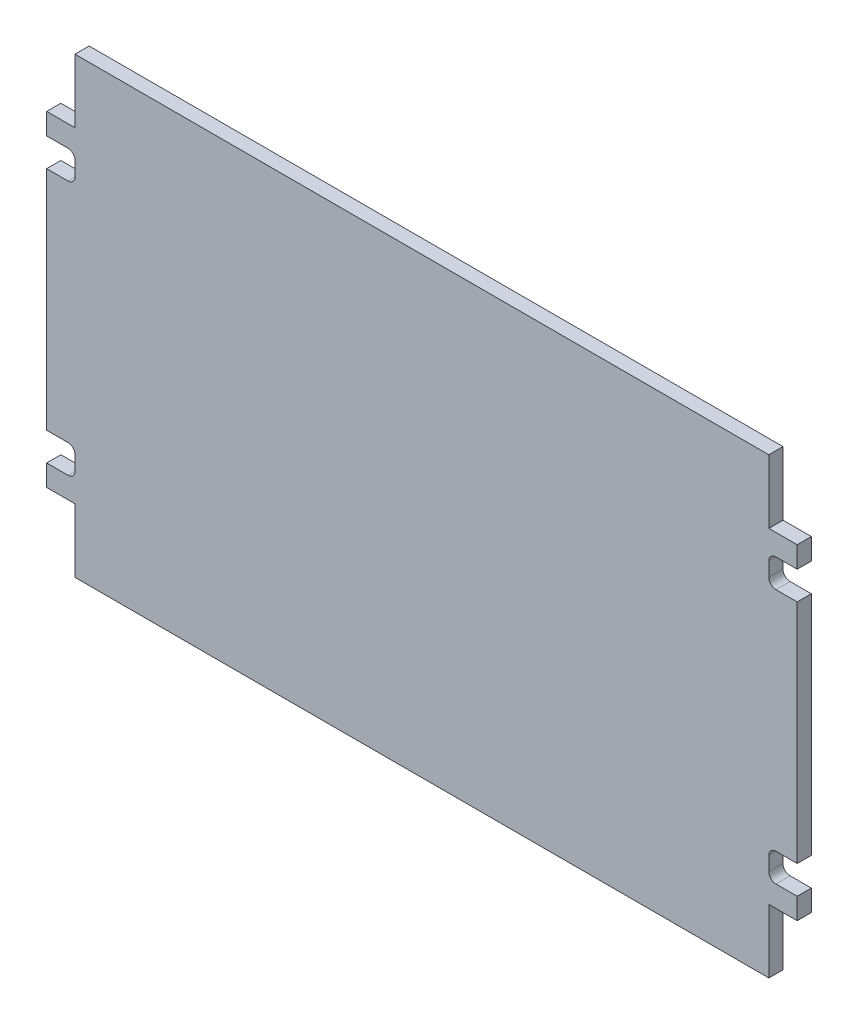
ISO-10303-21;
HEADER;
FILE_DESCRIPTION(('STEP AP214'),'2;1');
FILE_NAME('part.step','',(''),(''),'','','');
FILE_SCHEMA(('AUTOMOTIVE_DESIGN { 1 0 10303 214 1 1 1 1 }'));
ENDSEC;
DATA;
#1=APPLICATION_CONTEXT('core data for automotive mechanical design processes');
#2=APPLICATION_PROTOCOL_DEFINITION('international standard','automotive_design',2000,#1);
#3=PRODUCT_CONTEXT('',#1,'mechanical');
#4=PRODUCT('Part','Part','',(#3));
#5=PRODUCT_RELATED_PRODUCT_CATEGORY('part','',(#4));
#6=PRODUCT_DEFINITION_FORMATION('','',#4);
#7=PRODUCT_DEFINITION_CONTEXT('part definition',#1,'design');
#8=PRODUCT_DEFINITION('design','',#6,#7);
#9=PRODUCT_DEFINITION_SHAPE('','',#8);
#10=(LENGTH_UNIT() NAMED_UNIT(*) SI_UNIT(.MILLI.,.METRE.));
#11=(NAMED_UNIT(*) PLANE_ANGLE_UNIT() SI_UNIT($,.RADIAN.));
#12=(NAMED_UNIT(*) SI_UNIT($,.STERADIAN.) SOLID_ANGLE_UNIT());
#13=UNCERTAINTY_MEASURE_WITH_UNIT(LENGTH_MEASURE(1.E-05),#10,'distance_accuracy_value','');
#14=(GEOMETRIC_REPRESENTATION_CONTEXT(3) GLOBAL_UNCERTAINTY_ASSIGNED_CONTEXT((#13)) GLOBAL_UNIT_ASSIGNED_CONTEXT((#10,
#11,#12)) REPRESENTATION_CONTEXT('',''));
#15=CARTESIAN_POINT('',(0.,0.,0.));
#16=DIRECTION('',(0.,0.,1.));
#17=DIRECTION('',(1.,0.,0.));
#18=AXIS2_PLACEMENT_3D('',#15,#16,#17);
#19=CARTESIAN_POINT('',(0.,0.,2.));
#20=DIRECTION('',(1.,0.,0.));
#21=DIRECTION('',(0.,0.,-1.));
#22=AXIS2_PLACEMENT_3D('',#19,#20,#21);
#23=PLANE('',#22);
#24=DIRECTION('',(0.,-1.,0.));
#25=VECTOR('',#24,1.);
#26=CARTESIAN_POINT('',(0.,0.,0.));
#27=LINE('',#26,#25);
#28=CARTESIAN_POINT('',(0.,55.,0.));
#29=VERTEX_POINT('',#28);
#30=CARTESIAN_POINT('',(0.,52.,0.));
#31=VERTEX_POINT('',#30);
#32=EDGE_CURVE('E307',#29,#31,#27,.T.);
#33=ORIENTED_EDGE('',*,*,#32,.T.);
#34=DIRECTION('',(0.,0.,1.));
#35=VECTOR('',#34,1.);
#36=CARTESIAN_POINT('',(0.,52.,0.));
#37=LINE('',#36,#35);
#38=CARTESIAN_POINT('',(0.,52.,2.));
#39=VERTEX_POINT('',#38);
#40=EDGE_CURVE('E602',#31,#39,#37,.T.);
#41=ORIENTED_EDGE('',*,*,#40,.T.);
#42=DIRECTION('',(0.,-1.,0.));
#43=VECTOR('',#42,1.);
#44=CARTESIAN_POINT('',(0.,0.,2.));
#45=LINE('',#44,#43);
#46=CARTESIAN_POINT('',(0.,55.,2.));
#47=VERTEX_POINT('',#46);
#48=EDGE_CURVE('E552',#47,#39,#45,.T.);
#49=ORIENTED_EDGE('',*,*,#48,.F.);
#50=DIRECTION('',(0.,0.,1.));
#51=VECTOR('',#50,1.);
#52=CARTESIAN_POINT('',(0.,55.,0.));
#53=LINE('',#52,#51);
#54=EDGE_CURVE('E542',#29,#47,#53,.T.);
#55=ORIENTED_EDGE('',*,*,#54,.F.);
#56=EDGE_LOOP('',(#33,#41,#49,#55));
#57=FACE_BOUND('',#56,.T.);
#58=ADVANCED_FACE('F39',(#57),#23,.F.);
#59=CARTESIAN_POINT('',(0.,48.,2.));
#60=VERTEX_POINT('',#59);
#61=CARTESIAN_POINT('',(0.,16.,2.));
#62=VERTEX_POINT('',#61);
#63=EDGE_CURVE('E557',#60,#62,#45,.T.);
#64=ORIENTED_EDGE('',*,*,#63,.F.);
#65=DIRECTION('',(0.,0.,1.));
#66=VECTOR('',#65,1.);
#67=CARTESIAN_POINT('',(0.,48.,0.));
#68=LINE('',#67,#66);
#69=CARTESIAN_POINT('',(0.,48.,0.));
#70=VERTEX_POINT('',#69);
#71=EDGE_CURVE('E636',#70,#60,#68,.T.);
#72=ORIENTED_EDGE('',*,*,#71,.F.);
#73=CARTESIAN_POINT('',(0.,16.,0.));
#74=VERTEX_POINT('',#73);
#75=EDGE_CURVE('E304',#70,#74,#27,.T.);
#76=ORIENTED_EDGE('',*,*,#75,.T.);
#77=DIRECTION('',(0.,0.,1.));
#78=VECTOR('',#77,1.);
#79=CARTESIAN_POINT('',(0.,16.,0.));
#80=LINE('',#79,#78);
#81=EDGE_CURVE('E429',#74,#62,#80,.T.);
#82=ORIENTED_EDGE('',*,*,#81,.T.);
#83=EDGE_LOOP('',(#64,#72,#76,#82));
#84=FACE_BOUND('',#83,.T.);
#85=ADVANCED_FACE('F682',(#84),#23,.F.);
#86=CARTESIAN_POINT('',(106.,0.,2.));
#87=DIRECTION('',(-1.,0.,0.));
#88=DIRECTION('',(0.,0.,1.));
#89=AXIS2_PLACEMENT_3D('',#86,#87,#88);
#90=PLANE('',#89);
#91=DIRECTION('',(0.,1.,0.));
#92=VECTOR('',#91,1.);
#93=CARTESIAN_POINT('',(106.,0.,0.));
#94=LINE('',#93,#92);
#95=CARTESIAN_POINT('',(106.,16.,0.));
#96=VERTEX_POINT('',#95);
#97=CARTESIAN_POINT('',(106.,48.,0.));
#98=VERTEX_POINT('',#97);
#99=EDGE_CURVE('E330',#96,#98,#94,.T.);
#100=ORIENTED_EDGE('',*,*,#99,.T.);
#101=DIRECTION('',(0.,0.,1.));
#102=VECTOR('',#101,1.);
#103=CARTESIAN_POINT('',(106.,48.,0.));
#104=LINE('',#103,#102);
#105=CARTESIAN_POINT('',(106.,48.,2.));
#106=VERTEX_POINT('',#105);
#107=EDGE_CURVE('E348',#98,#106,#104,.T.);
#108=ORIENTED_EDGE('',*,*,#107,.T.);
#109=DIRECTION('',(0.,1.,0.));
#110=VECTOR('',#109,1.);
#111=CARTESIAN_POINT('',(106.,0.,2.));
#112=LINE('',#111,#110);
#113=CARTESIAN_POINT('',(106.,16.,2.));
#114=VERTEX_POINT('',#113);
#115=EDGE_CURVE('E564',#114,#106,#112,.T.);
#116=ORIENTED_EDGE('',*,*,#115,.F.);
#117=DIRECTION('',(0.,0.,1.));
#118=VECTOR('',#117,1.);
#119=CARTESIAN_POINT('',(106.,16.,0.));
#120=LINE('',#119,#118);
#121=EDGE_CURVE('E350',#96,#114,#120,.T.);
#122=ORIENTED_EDGE('',*,*,#121,.F.);
#123=EDGE_LOOP('',(#100,#108,#116,#122));
#124=FACE_BOUND('',#123,.T.);
#125=ADVANCED_FACE('F346',(#124),#90,.F.);
#126=CARTESIAN_POINT('',(106.,9.,0.));
#127=VERTEX_POINT('',#126);
#128=CARTESIAN_POINT('',(106.,12.,0.));
#129=VERTEX_POINT('',#128);
#130=EDGE_CURVE('E331',#127,#129,#94,.T.);
#131=ORIENTED_EDGE('',*,*,#130,.T.);
#132=DIRECTION('',(0.,0.,1.));
#133=VECTOR('',#132,1.);
#134=CARTESIAN_POINT('',(106.,12.,0.));
#135=LINE('',#134,#133);
#136=CARTESIAN_POINT('',(106.,12.,2.));
#137=VERTEX_POINT('',#136);
#138=EDGE_CURVE('E443',#129,#137,#135,.T.);
#139=ORIENTED_EDGE('',*,*,#138,.T.);
#140=CARTESIAN_POINT('',(106.,9.,2.));
#141=VERTEX_POINT('',#140);
#142=EDGE_CURVE('E49',#141,#137,#112,.T.);
#143=ORIENTED_EDGE('',*,*,#142,.F.);
#144=DIRECTION('',(0.,0.,1.));
#145=VECTOR('',#144,1.);
#146=CARTESIAN_POINT('',(106.,9.,0.));
#147=LINE('',#146,#145);
#148=EDGE_CURVE('E494',#127,#141,#147,.T.);
#149=ORIENTED_EDGE('',*,*,#148,.F.);
#150=EDGE_LOOP('',(#131,#139,#143,#149));
#151=FACE_BOUND('',#150,.T.);
#152=ADVANCED_FACE('F674',(#151),#90,.F.);
#153=CARTESIAN_POINT('',(0.,12.,2.));
#154=VERTEX_POINT('',#153);
#155=CARTESIAN_POINT('',(0.,9.,2.));
#156=VERTEX_POINT('',#155);
#157=EDGE_CURVE('E294',#154,#156,#45,.T.);
#158=ORIENTED_EDGE('',*,*,#157,.F.);
#159=DIRECTION('',(0.,0.,1.));
#160=VECTOR('',#159,1.);
#161=CARTESIAN_POINT('',(0.,12.,0.));
#162=LINE('',#161,#160);
#163=CARTESIAN_POINT('',(0.,12.,0.));
#164=VERTEX_POINT('',#163);
#165=EDGE_CURVE('E279',#164,#154,#162,.T.);
#166=ORIENTED_EDGE('',*,*,#165,.F.);
#167=CARTESIAN_POINT('',(0.,9.,0.));
#168=VERTEX_POINT('',#167);
#169=EDGE_CURVE('E292',#164,#168,#27,.T.);
#170=ORIENTED_EDGE('',*,*,#169,.T.);
#171=DIRECTION('',(0.,0.,1.));
#172=VECTOR('',#171,1.);
#173=CARTESIAN_POINT('',(0.,9.,0.));
#174=LINE('',#173,#172);
#175=EDGE_CURVE('E476',#168,#156,#174,.T.);
#176=ORIENTED_EDGE('',*,*,#175,.T.);
#177=EDGE_LOOP('',(#158,#166,#170,#176));
#178=FACE_BOUND('',#177,.T.);
#179=ADVANCED_FACE('F41',(#178),#23,.F.);
#180=CARTESIAN_POINT('',(0.,0.,2.));
#181=DIRECTION('',(0.,1.,0.));
#182=DIRECTION('',(0.,0.,1.));
#183=AXIS2_PLACEMENT_3D('',#180,#181,#182);
#184=PLANE('',#183);
#185=DIRECTION('',(1.,0.,0.));
#186=VECTOR('',#185,1.);
#187=CARTESIAN_POINT('',(0.,0.,0.));
#188=LINE('',#187,#186);
#189=CARTESIAN_POINT('',(4.,0.,0.));
#190=VERTEX_POINT('',#189);
#191=CARTESIAN_POINT('',(102.,0.,0.));
#192=VERTEX_POINT('',#191);
#193=EDGE_CURVE('E317',#190,#192,#188,.T.);
#194=ORIENTED_EDGE('',*,*,#193,.T.);
#195=DIRECTION('',(0.,0.,1.));
#196=VECTOR('',#195,1.);
#197=CARTESIAN_POINT('',(102.,0.,0.));
#198=LINE('',#197,#196);
#199=CARTESIAN_POINT('',(102.,0.,2.));
#200=VERTEX_POINT('',#199);
#201=EDGE_CURVE('E472',#192,#200,#198,.T.);
#202=ORIENTED_EDGE('',*,*,#201,.T.);
#203=DIRECTION('',(1.,0.,0.));
#204=VECTOR('',#203,1.);
#205=CARTESIAN_POINT('',(0.,0.,2.));
#206=LINE('',#205,#204);
#207=CARTESIAN_POINT('',(4.,0.,2.));
#208=VERTEX_POINT('',#207);
#209=EDGE_CURVE('E556',#208,#200,#206,.T.);
#210=ORIENTED_EDGE('',*,*,#209,.F.);
#211=DIRECTION('',(0.,0.,1.));
#212=VECTOR('',#211,1.);
#213=CARTESIAN_POINT('',(4.,0.,0.));
#214=LINE('',#213,#212);
#215=EDGE_CURVE('E467',#190,#208,#214,.T.);
#216=ORIENTED_EDGE('',*,*,#215,.F.);
#217=EDGE_LOOP('',(#194,#202,#210,#216));
#218=FACE_BOUND('',#217,.T.);
#219=ADVANCED_FACE('F681',(#218),#184,.F.);
#220=CARTESIAN_POINT('',(106.,52.,2.));
#221=VERTEX_POINT('',#220);
#222=CARTESIAN_POINT('',(106.,55.,2.));
#223=VERTEX_POINT('',#222);
#224=EDGE_CURVE('E561',#221,#223,#112,.T.);
#225=ORIENTED_EDGE('',*,*,#224,.F.);
#226=DIRECTION('',(0.,0.,1.));
#227=VECTOR('',#226,1.);
#228=CARTESIAN_POINT('',(106.,52.,0.));
#229=LINE('',#228,#227);
#230=CARTESIAN_POINT('',(106.,52.,0.));
#231=VERTEX_POINT('',#230);
#232=EDGE_CURVE('E362',#231,#221,#229,.T.);
#233=ORIENTED_EDGE('',*,*,#232,.F.);
#234=CARTESIAN_POINT('',(106.,55.,0.));
#235=VERTEX_POINT('',#234);
#236=EDGE_CURVE('E324',#231,#235,#94,.T.);
#237=ORIENTED_EDGE('',*,*,#236,.T.);
#238=DIRECTION('',(0.,0.,1.));
#239=VECTOR('',#238,1.);
#240=CARTESIAN_POINT('',(106.,55.,0.));
#241=LINE('',#240,#239);
#242=EDGE_CURVE('E499',#235,#223,#241,.T.);
#243=ORIENTED_EDGE('',*,*,#242,.T.);
#244=EDGE_LOOP('',(#225,#233,#237,#243));
#245=FACE_BOUND('',#244,.T.);
#246=ADVANCED_FACE('F583',(#245),#90,.F.);
#247=CARTESIAN_POINT('',(0.,64.,2.));
#248=DIRECTION('',(0.,-1.,0.));
#249=DIRECTION('',(0.,0.,-1.));
#250=AXIS2_PLACEMENT_3D('',#247,#248,#249);
#251=PLANE('',#250);
#252=DIRECTION('',(-1.,0.,0.));
#253=VECTOR('',#252,1.);
#254=CARTESIAN_POINT('',(0.,64.,2.));
#255=LINE('',#254,#253);
#256=CARTESIAN_POINT('',(102.,64.,2.));
#257=VERTEX_POINT('',#256);
#258=CARTESIAN_POINT('',(4.,64.,2.));
#259=VERTEX_POINT('',#258);
#260=EDGE_CURVE('E11',#257,#259,#255,.T.);
#261=ORIENTED_EDGE('',*,*,#260,.F.);
#262=DIRECTION('',(0.,0.,1.));
#263=VECTOR('',#262,1.);
#264=CARTESIAN_POINT('',(102.,64.,0.));
#265=LINE('',#264,#263);
#266=CARTESIAN_POINT('',(102.,64.,0.));
#267=VERTEX_POINT('',#266);
#268=EDGE_CURVE('E518',#267,#257,#265,.T.);
#269=ORIENTED_EDGE('',*,*,#268,.F.);
#270=DIRECTION('',(-1.,0.,0.));
#271=VECTOR('',#270,1.);
#272=CARTESIAN_POINT('',(0.,64.,0.));
#273=LINE('',#272,#271);
#274=CARTESIAN_POINT('',(4.,64.,0.));
#275=VERTEX_POINT('',#274);
#276=EDGE_CURVE('E43',#267,#275,#273,.T.);
#277=ORIENTED_EDGE('',*,*,#276,.T.);
#278=DIRECTION('',(0.,0.,1.));
#279=VECTOR('',#278,1.);
#280=CARTESIAN_POINT('',(4.,64.,0.));
#281=LINE('',#280,#279);
#282=EDGE_CURVE('E305',#275,#259,#281,.T.);
#283=ORIENTED_EDGE('',*,*,#282,.T.);
#284=EDGE_LOOP('',(#261,#269,#277,#283));
#285=FACE_BOUND('',#284,.T.);
#286=ADVANCED_FACE('F593',(#285),#251,.F.);
#287=CARTESIAN_POINT('',(0.,0.,2.));
#288=DIRECTION('',(0.,0.,-1.));
#289=DIRECTION('',(-1.,0.,0.));
#290=AXIS2_PLACEMENT_3D('',#287,#288,#289);
#291=PLANE('',#290);
#292=ORIENTED_EDGE('',*,*,#115,.T.);
#293=DIRECTION('',(1.,0.,0.));
#294=VECTOR('',#293,1.);
#295=CARTESIAN_POINT('',(106.,48.,2.));
#296=LINE('',#295,#294);
#297=CARTESIAN_POINT('',(103.,48.,2.));
#298=VERTEX_POINT('',#297);
#299=EDGE_CURVE('E388',#298,#106,#296,.T.);
#300=ORIENTED_EDGE('',*,*,#299,.F.);
#301=CARTESIAN_POINT('',(103.,49.,2.));
#302=DIRECTION('',(0.,0.,1.));
#303=DIRECTION('',(-1.,0.,0.));
#304=AXIS2_PLACEMENT_3D('',#301,#302,#303);
#305=CIRCLE('',#304,0.999999999999994);
#306=CARTESIAN_POINT('',(102.,49.,2.));
#307=VERTEX_POINT('',#306);
#308=EDGE_CURVE('E384',#307,#298,#305,.T.);
#309=ORIENTED_EDGE('',*,*,#308,.F.);
#310=DIRECTION('',(0.,-1.,0.));
#311=VECTOR('',#310,1.);
#312=CARTESIAN_POINT('',(102.,51.,2.));
#313=LINE('',#312,#311);
#314=CARTESIAN_POINT('',(102.,51.,2.));
#315=VERTEX_POINT('',#314);
#316=EDGE_CURVE('E380',#315,#307,#313,.T.);
#317=ORIENTED_EDGE('',*,*,#316,.F.);
#318=CARTESIAN_POINT('',(103.,51.,2.));
#319=DIRECTION('',(0.,0.,1.));
#320=DIRECTION('',(-1.,0.,0.));
#321=AXIS2_PLACEMENT_3D('',#318,#319,#320);
#322=CIRCLE('',#321,0.999999999999994);
#323=CARTESIAN_POINT('',(103.,52.,2.));
#324=VERTEX_POINT('',#323);
#325=EDGE_CURVE('E376',#324,#315,#322,.T.);
#326=ORIENTED_EDGE('',*,*,#325,.F.);
#327=DIRECTION('',(-1.,0.,0.));
#328=VECTOR('',#327,1.);
#329=CARTESIAN_POINT('',(106.,52.,2.));
#330=LINE('',#329,#328);
#331=EDGE_CURVE('E372',#221,#324,#330,.T.);
#332=ORIENTED_EDGE('',*,*,#331,.F.);
#333=ORIENTED_EDGE('',*,*,#224,.T.);
#334=DIRECTION('',(1.,0.,0.));
#335=VECTOR('',#334,1.);
#336=CARTESIAN_POINT('',(106.,55.,2.));
#337=LINE('',#336,#335);
#338=CARTESIAN_POINT('',(102.,55.,2.));
#339=VERTEX_POINT('',#338);
#340=EDGE_CURVE('E514',#339,#223,#337,.T.);
#341=ORIENTED_EDGE('',*,*,#340,.F.);
#342=DIRECTION('',(0.,-1.,0.));
#343=VECTOR('',#342,1.);
#344=CARTESIAN_POINT('',(102.,64.,2.));
#345=LINE('',#344,#343);
#346=EDGE_CURVE('E446',#257,#339,#345,.T.);
#347=ORIENTED_EDGE('',*,*,#346,.F.);
#348=ORIENTED_EDGE('',*,*,#260,.T.);
#349=DIRECTION('',(0.,1.,0.));
#350=VECTOR('',#349,1.);
#351=CARTESIAN_POINT('',(4.,64.,2.));
#352=LINE('',#351,#350);
#353=CARTESIAN_POINT('',(4.,55.,2.));
#354=VERTEX_POINT('',#353);
#355=EDGE_CURVE('E538',#354,#259,#352,.T.);
#356=ORIENTED_EDGE('',*,*,#355,.F.);
#357=DIRECTION('',(1.,0.,0.));
#358=VECTOR('',#357,1.);
#359=CARTESIAN_POINT('',(0.,55.,2.));
#360=LINE('',#359,#358);
#361=EDGE_CURVE('E479',#47,#354,#360,.T.);
#362=ORIENTED_EDGE('',*,*,#361,.F.);
#363=ORIENTED_EDGE('',*,*,#48,.T.);
#364=DIRECTION('',(-1.,0.,0.));
#365=VECTOR('',#364,1.);
#366=CARTESIAN_POINT('',(0.,52.,2.));
#367=LINE('',#366,#365);
#368=CARTESIAN_POINT('',(3.,52.,2.));
#369=VERTEX_POINT('',#368);
#370=EDGE_CURVE('E605',#369,#39,#367,.T.);
#371=ORIENTED_EDGE('',*,*,#370,.F.);
#372=CARTESIAN_POINT('',(3.,51.,2.));
#373=DIRECTION('',(0.,0.,1.));
#374=DIRECTION('',(1.,0.,0.));
#375=AXIS2_PLACEMENT_3D('',#372,#373,#374);
#376=CIRCLE('',#375,1.);
#377=CARTESIAN_POINT('',(4.,51.,2.));
#378=VERTEX_POINT('',#377);
#379=EDGE_CURVE('E608',#378,#369,#376,.T.);
#380=ORIENTED_EDGE('',*,*,#379,.F.);
#381=DIRECTION('',(0.,1.,0.));
#382=VECTOR('',#381,1.);
#383=CARTESIAN_POINT('',(4.,51.,2.));
#384=LINE('',#383,#382);
#385=CARTESIAN_POINT('',(4.,49.,2.));
#386=VERTEX_POINT('',#385);
#387=EDGE_CURVE('E617',#386,#378,#384,.T.);
#388=ORIENTED_EDGE('',*,*,#387,.F.);
#389=CARTESIAN_POINT('',(3.,49.,2.));
#390=DIRECTION('',(0.,0.,1.));
#391=DIRECTION('',(-1.,0.,0.));
#392=AXIS2_PLACEMENT_3D('',#389,#390,#391);
#393=CIRCLE('',#392,1.);
#394=CARTESIAN_POINT('',(3.,48.,2.));
#395=VERTEX_POINT('',#394);
#396=EDGE_CURVE('E1019',#395,#386,#393,.T.);
#397=ORIENTED_EDGE('',*,*,#396,.F.);
#398=DIRECTION('',(1.,0.,0.));
#399=VECTOR('',#398,1.);
#400=CARTESIAN_POINT('',(0.,48.,2.));
#401=LINE('',#400,#399);
#402=EDGE_CURVE('E394',#60,#395,#401,.T.);
#403=ORIENTED_EDGE('',*,*,#402,.F.);
#404=ORIENTED_EDGE('',*,*,#63,.T.);
#405=DIRECTION('',(-1.,0.,0.));
#406=VECTOR('',#405,1.);
#407=CARTESIAN_POINT('',(0.,16.,2.));
#408=LINE('',#407,#406);
#409=CARTESIAN_POINT('',(3.,16.,2.));
#410=VERTEX_POINT('',#409);
#411=EDGE_CURVE('E287',#410,#62,#408,.T.);
#412=ORIENTED_EDGE('',*,*,#411,.F.);
#413=CARTESIAN_POINT('',(3.,15.,2.));
#414=DIRECTION('',(0.,0.,1.));
#415=DIRECTION('',(1.,0.,0.));
#416=AXIS2_PLACEMENT_3D('',#413,#414,#415);
#417=CIRCLE('',#416,0.999999999999999);
#418=CARTESIAN_POINT('',(4.,15.,2.));
#419=VERTEX_POINT('',#418);
#420=EDGE_CURVE('E1054',#419,#410,#417,.T.);
#421=ORIENTED_EDGE('',*,*,#420,.F.);
#422=DIRECTION('',(0.,1.,0.));
#423=VECTOR('',#422,1.);
#424=CARTESIAN_POINT('',(4.,13.,2.));
#425=LINE('',#424,#423);
#426=CARTESIAN_POINT('',(4.,13.,2.));
#427=VERTEX_POINT('',#426);
#428=EDGE_CURVE('E1058',#427,#419,#425,.T.);
#429=ORIENTED_EDGE('',*,*,#428,.F.);
#430=CARTESIAN_POINT('',(3.,13.,2.));
#431=DIRECTION('',(0.,0.,1.));
#432=DIRECTION('',(1.,0.,0.));
#433=AXIS2_PLACEMENT_3D('',#430,#431,#432);
#434=CIRCLE('',#433,1.);
#435=CARTESIAN_POINT('',(3.,12.,2.));
#436=VERTEX_POINT('',#435);
#437=EDGE_CURVE('E1062',#436,#427,#434,.T.);
#438=ORIENTED_EDGE('',*,*,#437,.F.);
#439=DIRECTION('',(1.,0.,0.));
#440=VECTOR('',#439,1.);
#441=CARTESIAN_POINT('',(0.,12.,2.));
#442=LINE('',#441,#440);
#443=EDGE_CURVE('E623',#154,#436,#442,.T.);
#444=ORIENTED_EDGE('',*,*,#443,.F.);
#445=ORIENTED_EDGE('',*,*,#157,.T.);
#446=DIRECTION('',(-1.,0.,0.));
#447=VECTOR('',#446,1.);
#448=CARTESIAN_POINT('',(0.,9.,2.));
#449=LINE('',#448,#447);
#450=CARTESIAN_POINT('',(4.,9.,2.));
#451=VERTEX_POINT('',#450);
#452=EDGE_CURVE('E464',#451,#156,#449,.T.);
#453=ORIENTED_EDGE('',*,*,#452,.F.);
#454=DIRECTION('',(0.,1.,0.));
#455=VECTOR('',#454,1.);
#456=CARTESIAN_POINT('',(4.,0.,2.));
#457=LINE('',#456,#455);
#458=EDGE_CURVE('E468',#208,#451,#457,.T.);
#459=ORIENTED_EDGE('',*,*,#458,.F.);
#460=ORIENTED_EDGE('',*,*,#209,.T.);
#461=DIRECTION('',(0.,-1.,0.));
#462=VECTOR('',#461,1.);
#463=CARTESIAN_POINT('',(102.,0.,2.));
#464=LINE('',#463,#462);
#465=CARTESIAN_POINT('',(102.,9.,2.));
#466=VERTEX_POINT('',#465);
#467=EDGE_CURVE('E490',#466,#200,#464,.T.);
#468=ORIENTED_EDGE('',*,*,#467,.F.);
#469=DIRECTION('',(-1.,0.,0.));
#470=VECTOR('',#469,1.);
#471=CARTESIAN_POINT('',(106.,9.,2.));
#472=LINE('',#471,#470);
#473=EDGE_CURVE('E495',#141,#466,#472,.T.);
#474=ORIENTED_EDGE('',*,*,#473,.F.);
#475=ORIENTED_EDGE('',*,*,#142,.T.);
#476=DIRECTION('',(1.,0.,0.));
#477=VECTOR('',#476,1.);
#478=CARTESIAN_POINT('',(106.,12.,2.));
#479=LINE('',#478,#477);
#480=CARTESIAN_POINT('',(103.,12.,2.));
#481=VERTEX_POINT('',#480);
#482=EDGE_CURVE('E409',#481,#137,#479,.T.);
#483=ORIENTED_EDGE('',*,*,#482,.F.);
#484=CARTESIAN_POINT('',(103.,13.,2.));
#485=DIRECTION('',(0.,0.,1.));
#486=DIRECTION('',(-1.,0.,0.));
#487=AXIS2_PLACEMENT_3D('',#484,#485,#486);
#488=CIRCLE('',#487,1.);
#489=CARTESIAN_POINT('',(102.,13.,2.));
#490=VERTEX_POINT('',#489);
#491=EDGE_CURVE('E437',#490,#481,#488,.T.);
#492=ORIENTED_EDGE('',*,*,#491,.F.);
#493=DIRECTION('',(0.,-1.,0.));
#494=VECTOR('',#493,1.);
#495=CARTESIAN_POINT('',(102.,13.,2.));
#496=LINE('',#495,#494);
#497=CARTESIAN_POINT('',(102.,15.,2.));
#498=VERTEX_POINT('',#497);
#499=EDGE_CURVE('E433',#498,#490,#496,.T.);
#500=ORIENTED_EDGE('',*,*,#499,.F.);
#501=CARTESIAN_POINT('',(103.,15.,2.));
#502=DIRECTION('',(0.,0.,1.));
#503=DIRECTION('',(-1.,0.,0.));
#504=AXIS2_PLACEMENT_3D('',#501,#502,#503);
#505=CIRCLE('',#504,1.);
#506=CARTESIAN_POINT('',(103.,16.,2.));
#507=VERTEX_POINT('',#506);
#508=EDGE_CURVE('E428',#507,#498,#505,.T.);
#509=ORIENTED_EDGE('',*,*,#508,.F.);
#510=DIRECTION('',(-1.,0.,0.));
#511=VECTOR('',#510,1.);
#512=CARTESIAN_POINT('',(106.,16.,2.));
#513=LINE('',#512,#511);
#514=EDGE_CURVE('E424',#114,#507,#513,.T.);
#515=ORIENTED_EDGE('',*,*,#514,.F.);
#516=EDGE_LOOP('',(#292,#300,#309,#317,#326,#332,#333,#341,#347,#348,#356,#362,#363,#371,#380,
#388,#397,#403,#404,#412,#421,#429,#438,#444,#445,#453,#459,#460,#468,#474,#475,#483,#492,#500,
#509,#515));
#517=FACE_BOUND('',#516,.T.);
#518=ADVANCED_FACE('F574',(#517),#291,.F.);
#519=CARTESIAN_POINT('',(0.,0.,0.));
#520=DIRECTION('',(0.,0.,-1.));
#521=DIRECTION('',(-1.,0.,0.));
#522=AXIS2_PLACEMENT_3D('',#519,#520,#521);
#523=PLANE('',#522);
#524=DIRECTION('',(1.,0.,0.));
#525=VECTOR('',#524,1.);
#526=CARTESIAN_POINT('',(106.,48.,0.));
#527=LINE('',#526,#525);
#528=CARTESIAN_POINT('',(103.,48.,0.));
#529=VERTEX_POINT('',#528);
#530=EDGE_CURVE('E356',#529,#98,#527,.T.);
#531=ORIENTED_EDGE('',*,*,#530,.T.);
#532=ORIENTED_EDGE('',*,*,#99,.F.);
#533=DIRECTION('',(-1.,0.,0.));
#534=VECTOR('',#533,1.);
#535=CARTESIAN_POINT('',(106.,16.,0.));
#536=LINE('',#535,#534);
#537=CARTESIAN_POINT('',(103.,16.,0.));
#538=VERTEX_POINT('',#537);
#539=EDGE_CURVE('E353',#96,#538,#536,.T.);
#540=ORIENTED_EDGE('',*,*,#539,.T.);
#541=CARTESIAN_POINT('',(103.,15.,0.));
#542=DIRECTION('',(0.,0.,1.));
#543=DIRECTION('',(-1.,0.,0.));
#544=AXIS2_PLACEMENT_3D('',#541,#542,#543);
#545=CIRCLE('',#544,1.);
#546=CARTESIAN_POINT('',(102.,15.,0.));
#547=VERTEX_POINT('',#546);
#548=EDGE_CURVE('E408',#538,#547,#545,.T.);
#549=ORIENTED_EDGE('',*,*,#548,.T.);
#550=DIRECTION('',(0.,-1.,0.));
#551=VECTOR('',#550,1.);
#552=CARTESIAN_POINT('',(102.,13.,0.));
#553=LINE('',#552,#551);
#554=CARTESIAN_POINT('',(102.,13.,0.));
#555=VERTEX_POINT('',#554);
#556=EDGE_CURVE('E412',#547,#555,#553,.T.);
#557=ORIENTED_EDGE('',*,*,#556,.T.);
#558=CARTESIAN_POINT('',(103.,13.,0.));
#559=DIRECTION('',(0.,0.,1.));
#560=DIRECTION('',(-1.,0.,0.));
#561=AXIS2_PLACEMENT_3D('',#558,#559,#560);
#562=CIRCLE('',#561,1.);
#563=CARTESIAN_POINT('',(103.,12.,0.));
#564=VERTEX_POINT('',#563);
#565=EDGE_CURVE('E416',#555,#564,#562,.T.);
#566=ORIENTED_EDGE('',*,*,#565,.T.);
#567=DIRECTION('',(1.,0.,0.));
#568=VECTOR('',#567,1.);
#569=CARTESIAN_POINT('',(106.,12.,0.));
#570=LINE('',#569,#568);
#571=EDGE_CURVE('E420',#564,#129,#570,.T.);
#572=ORIENTED_EDGE('',*,*,#571,.T.);
#573=ORIENTED_EDGE('',*,*,#130,.F.);
#574=DIRECTION('',(-1.,0.,0.));
#575=VECTOR('',#574,1.);
#576=CARTESIAN_POINT('',(106.,9.,0.));
#577=LINE('',#576,#575);
#578=CARTESIAN_POINT('',(102.,9.,0.));
#579=VERTEX_POINT('',#578);
#580=EDGE_CURVE('E485',#127,#579,#577,.T.);
#581=ORIENTED_EDGE('',*,*,#580,.T.);
#582=DIRECTION('',(0.,-1.,0.));
#583=VECTOR('',#582,1.);
#584=CARTESIAN_POINT('',(102.,0.,0.));
#585=LINE('',#584,#583);
#586=EDGE_CURVE('E489',#579,#192,#585,.T.);
#587=ORIENTED_EDGE('',*,*,#586,.T.);
#588=ORIENTED_EDGE('',*,*,#193,.F.);
#589=DIRECTION('',(0.,1.,0.));
#590=VECTOR('',#589,1.);
#591=CARTESIAN_POINT('',(4.,0.,0.));
#592=LINE('',#591,#590);
#593=CARTESIAN_POINT('',(4.,9.,0.));
#594=VERTEX_POINT('',#593);
#595=EDGE_CURVE('E461',#190,#594,#592,.T.);
#596=ORIENTED_EDGE('',*,*,#595,.T.);
#597=DIRECTION('',(-1.,0.,0.));
#598=VECTOR('',#597,1.);
#599=CARTESIAN_POINT('',(0.,9.,0.));
#600=LINE('',#599,#598);
#601=EDGE_CURVE('E302',#594,#168,#600,.T.);
#602=ORIENTED_EDGE('',*,*,#601,.T.);
#603=ORIENTED_EDGE('',*,*,#169,.F.);
#604=DIRECTION('',(1.,0.,0.));
#605=VECTOR('',#604,1.);
#606=CARTESIAN_POINT('',(0.,12.,0.));
#607=LINE('',#606,#605);
#608=CARTESIAN_POINT('',(3.,12.,0.));
#609=VERTEX_POINT('',#608);
#610=EDGE_CURVE('E275',#164,#609,#607,.T.);
#611=ORIENTED_EDGE('',*,*,#610,.T.);
#612=CARTESIAN_POINT('',(3.,13.,0.));
#613=DIRECTION('',(0.,0.,1.));
#614=DIRECTION('',(1.,0.,0.));
#615=AXIS2_PLACEMENT_3D('',#612,#613,#614);
#616=CIRCLE('',#615,1.);
#617=CARTESIAN_POINT('',(4.,13.,0.));
#618=VERTEX_POINT('',#617);
#619=EDGE_CURVE('E286',#609,#618,#616,.T.);
#620=ORIENTED_EDGE('',*,*,#619,.T.);
#621=DIRECTION('',(0.,1.,0.));
#622=VECTOR('',#621,1.);
#623=CARTESIAN_POINT('',(4.,13.,0.));
#624=LINE('',#623,#622);
#625=CARTESIAN_POINT('',(4.,15.,0.));
#626=VERTEX_POINT('',#625);
#627=EDGE_CURVE('E1075',#618,#626,#624,.T.);
#628=ORIENTED_EDGE('',*,*,#627,.T.);
#629=CARTESIAN_POINT('',(3.,15.,0.));
#630=DIRECTION('',(0.,0.,1.));
#631=DIRECTION('',(1.,0.,0.));
#632=AXIS2_PLACEMENT_3D('',#629,#630,#631);
#633=CIRCLE('',#632,0.999999999999999);
#634=CARTESIAN_POINT('',(3.,16.,0.));
#635=VERTEX_POINT('',#634);
#636=EDGE_CURVE('E1071',#626,#635,#633,.T.);
#637=ORIENTED_EDGE('',*,*,#636,.T.);
#638=DIRECTION('',(-1.,0.,0.));
#639=VECTOR('',#638,1.);
#640=CARTESIAN_POINT('',(0.,16.,0.));
#641=LINE('',#640,#639);
#642=EDGE_CURVE('E296',#635,#74,#641,.T.);
#643=ORIENTED_EDGE('',*,*,#642,.T.);
#644=ORIENTED_EDGE('',*,*,#75,.F.);
#645=DIRECTION('',(1.,0.,0.));
#646=VECTOR('',#645,1.);
#647=CARTESIAN_POINT('',(0.,48.,0.));
#648=LINE('',#647,#646);
#649=CARTESIAN_POINT('',(3.,48.,0.));
#650=VERTEX_POINT('',#649);
#651=EDGE_CURVE('E611',#70,#650,#648,.T.);
#652=ORIENTED_EDGE('',*,*,#651,.T.);
#653=CARTESIAN_POINT('',(3.,49.,0.));
#654=DIRECTION('',(0.,0.,1.));
#655=DIRECTION('',(-1.,0.,0.));
#656=AXIS2_PLACEMENT_3D('',#653,#654,#655);
#657=CIRCLE('',#656,1.);
#658=CARTESIAN_POINT('',(4.,49.,0.));
#659=VERTEX_POINT('',#658);
#660=EDGE_CURVE('E65',#650,#659,#657,.T.);
#661=ORIENTED_EDGE('',*,*,#660,.T.);
#662=DIRECTION('',(0.,1.,0.));
#663=VECTOR('',#662,1.);
#664=CARTESIAN_POINT('',(4.,51.,0.));
#665=LINE('',#664,#663);
#666=CARTESIAN_POINT('',(4.,51.,0.));
#667=VERTEX_POINT('',#666);
#668=EDGE_CURVE('E1033',#659,#667,#665,.T.);
#669=ORIENTED_EDGE('',*,*,#668,.T.);
#670=CARTESIAN_POINT('',(3.,51.,0.));
#671=DIRECTION('',(0.,0.,1.));
#672=DIRECTION('',(1.,0.,0.));
#673=AXIS2_PLACEMENT_3D('',#670,#671,#672);
#674=CIRCLE('',#673,1.);
#675=CARTESIAN_POINT('',(3.,52.,0.));
#676=VERTEX_POINT('',#675);
#677=EDGE_CURVE('E1029',#667,#676,#674,.T.);
#678=ORIENTED_EDGE('',*,*,#677,.T.);
#679=DIRECTION('',(-1.,0.,0.));
#680=VECTOR('',#679,1.);
#681=CARTESIAN_POINT('',(0.,52.,0.));
#682=LINE('',#681,#680);
#683=EDGE_CURVE('E639',#676,#31,#682,.T.);
#684=ORIENTED_EDGE('',*,*,#683,.T.);
#685=ORIENTED_EDGE('',*,*,#32,.F.);
#686=DIRECTION('',(1.,0.,0.));
#687=VECTOR('',#686,1.);
#688=CARTESIAN_POINT('',(0.,55.,0.));
#689=LINE('',#688,#687);
#690=CARTESIAN_POINT('',(4.,55.,0.));
#691=VERTEX_POINT('',#690);
#692=EDGE_CURVE('E533',#29,#691,#689,.T.);
#693=ORIENTED_EDGE('',*,*,#692,.T.);
#694=DIRECTION('',(0.,1.,0.));
#695=VECTOR('',#694,1.);
#696=CARTESIAN_POINT('',(4.,64.,0.));
#697=LINE('',#696,#695);
#698=EDGE_CURVE('E537',#691,#275,#697,.T.);
#699=ORIENTED_EDGE('',*,*,#698,.T.);
#700=ORIENTED_EDGE('',*,*,#276,.F.);
#701=DIRECTION('',(0.,-1.,0.));
#702=VECTOR('',#701,1.);
#703=CARTESIAN_POINT('',(102.,64.,0.));
#704=LINE('',#703,#702);
#705=CARTESIAN_POINT('',(102.,55.,0.));
#706=VERTEX_POINT('',#705);
#707=EDGE_CURVE('E509',#267,#706,#704,.T.);
#708=ORIENTED_EDGE('',*,*,#707,.T.);
#709=DIRECTION('',(1.,0.,0.));
#710=VECTOR('',#709,1.);
#711=CARTESIAN_POINT('',(106.,55.,0.));
#712=LINE('',#711,#710);
#713=EDGE_CURVE('E513',#706,#235,#712,.T.);
#714=ORIENTED_EDGE('',*,*,#713,.T.);
#715=ORIENTED_EDGE('',*,*,#236,.F.);
#716=DIRECTION('',(-1.,0.,0.));
#717=VECTOR('',#716,1.);
#718=CARTESIAN_POINT('',(106.,52.,0.));
#719=LINE('',#718,#717);
#720=CARTESIAN_POINT('',(103.,52.,0.));
#721=VERTEX_POINT('',#720);
#722=EDGE_CURVE('E391',#231,#721,#719,.T.);
#723=ORIENTED_EDGE('',*,*,#722,.T.);
#724=CARTESIAN_POINT('',(103.,51.,0.));
#725=DIRECTION('',(0.,0.,1.));
#726=DIRECTION('',(-1.,0.,0.));
#727=AXIS2_PLACEMENT_3D('',#724,#725,#726);
#728=CIRCLE('',#727,0.999999999999994);
#729=CARTESIAN_POINT('',(102.,51.,0.));
#730=VERTEX_POINT('',#729);
#731=EDGE_CURVE('E57',#721,#730,#728,.T.);
#732=ORIENTED_EDGE('',*,*,#731,.T.);
#733=DIRECTION('',(0.,-1.,0.));
#734=VECTOR('',#733,1.);
#735=CARTESIAN_POINT('',(102.,51.,0.));
#736=LINE('',#735,#734);
#737=CARTESIAN_POINT('',(102.,49.,0.));
#738=VERTEX_POINT('',#737);
#739=EDGE_CURVE('E368',#730,#738,#736,.T.);
#740=ORIENTED_EDGE('',*,*,#739,.T.);
#741=CARTESIAN_POINT('',(103.,49.,0.));
#742=DIRECTION('',(0.,0.,1.));
#743=DIRECTION('',(-1.,0.,0.));
#744=AXIS2_PLACEMENT_3D('',#741,#742,#743);
#745=CIRCLE('',#744,0.999999999999994);
#746=EDGE_CURVE('E359',#738,#529,#745,.T.);
#747=ORIENTED_EDGE('',*,*,#746,.T.);
#748=EDGE_LOOP('',(#531,#532,#540,#549,#557,#566,#572,#573,#581,#587,#588,#596,#602,#603,#611,
#620,#628,#637,#643,#644,#652,#661,#669,#678,#684,#685,#693,#699,#700,#708,#714,#715,#723,#732,
#740,#747));
#749=FACE_BOUND('',#748,.T.);
#750=ADVANCED_FACE('F300',(#749),#523,.T.);
#751=CARTESIAN_POINT('',(4.,64.,0.));
#752=DIRECTION('',(1.,0.,0.));
#753=DIRECTION('',(0.,0.,-1.));
#754=AXIS2_PLACEMENT_3D('',#751,#752,#753);
#755=PLANE('',#754);
#756=ORIENTED_EDGE('',*,*,#355,.T.);
#757=ORIENTED_EDGE('',*,*,#282,.F.);
#758=ORIENTED_EDGE('',*,*,#698,.F.);
#759=DIRECTION('',(0.,0.,1.));
#760=VECTOR('',#759,1.);
#761=CARTESIAN_POINT('',(4.,55.,0.));
#762=LINE('',#761,#760);
#763=EDGE_CURVE('E312',#691,#354,#762,.T.);
#764=ORIENTED_EDGE('',*,*,#763,.T.);
#765=EDGE_LOOP('',(#756,#757,#758,#764));
#766=FACE_BOUND('',#765,.T.);
#767=ADVANCED_FACE('F595',(#766),#755,.F.);
#768=CARTESIAN_POINT('',(0.,55.,0.));
#769=DIRECTION('',(0.,-1.,0.));
#770=DIRECTION('',(0.,0.,-1.));
#771=AXIS2_PLACEMENT_3D('',#768,#769,#770);
#772=PLANE('',#771);
#773=ORIENTED_EDGE('',*,*,#361,.T.);
#774=ORIENTED_EDGE('',*,*,#763,.F.);
#775=ORIENTED_EDGE('',*,*,#692,.F.);
#776=ORIENTED_EDGE('',*,*,#54,.T.);
#777=EDGE_LOOP('',(#773,#774,#775,#776));
#778=FACE_BOUND('',#777,.T.);
#779=ADVANCED_FACE('F599',(#778),#772,.F.);
#780=CARTESIAN_POINT('',(0.,9.,0.));
#781=DIRECTION('',(0.,1.,0.));
#782=DIRECTION('',(0.,0.,1.));
#783=AXIS2_PLACEMENT_3D('',#780,#781,#782);
#784=PLANE('',#783);
#785=ORIENTED_EDGE('',*,*,#452,.T.);
#786=ORIENTED_EDGE('',*,*,#175,.F.);
#787=ORIENTED_EDGE('',*,*,#601,.F.);
#788=DIRECTION('',(0.,0.,1.));
#789=VECTOR('',#788,1.);
#790=CARTESIAN_POINT('',(4.,9.,0.));
#791=LINE('',#790,#789);
#792=EDGE_CURVE('E480',#594,#451,#791,.T.);
#793=ORIENTED_EDGE('',*,*,#792,.T.);
#794=EDGE_LOOP('',(#785,#786,#787,#793));
#795=FACE_BOUND('',#794,.T.);
#796=ADVANCED_FACE('F705',(#795),#784,.F.);
#797=CARTESIAN_POINT('',(4.,0.,0.));
#798=DIRECTION('',(1.,0.,0.));
#799=DIRECTION('',(0.,0.,-1.));
#800=AXIS2_PLACEMENT_3D('',#797,#798,#799);
#801=PLANE('',#800);
#802=ORIENTED_EDGE('',*,*,#458,.T.);
#803=ORIENTED_EDGE('',*,*,#792,.F.);
#804=ORIENTED_EDGE('',*,*,#595,.F.);
#805=ORIENTED_EDGE('',*,*,#215,.T.);
#806=EDGE_LOOP('',(#802,#803,#804,#805));
#807=FACE_BOUND('',#806,.T.);
#808=ADVANCED_FACE('F708',(#807),#801,.F.);
#809=CARTESIAN_POINT('',(102.,0.,0.));
#810=DIRECTION('',(-1.,0.,0.));
#811=DIRECTION('',(0.,0.,1.));
#812=AXIS2_PLACEMENT_3D('',#809,#810,#811);
#813=PLANE('',#812);
#814=ORIENTED_EDGE('',*,*,#467,.T.);
#815=ORIENTED_EDGE('',*,*,#201,.F.);
#816=ORIENTED_EDGE('',*,*,#586,.F.);
#817=DIRECTION('',(0.,0.,1.));
#818=VECTOR('',#817,1.);
#819=CARTESIAN_POINT('',(102.,9.,0.));
#820=LINE('',#819,#818);
#821=EDGE_CURVE('E504',#579,#466,#820,.T.);
#822=ORIENTED_EDGE('',*,*,#821,.T.);
#823=EDGE_LOOP('',(#814,#815,#816,#822));
#824=FACE_BOUND('',#823,.T.);
#825=ADVANCED_FACE('F712',(#824),#813,.F.);
#826=CARTESIAN_POINT('',(106.,9.,0.));
#827=DIRECTION('',(0.,1.,0.));
#828=DIRECTION('',(-1.,0.,0.));
#829=AXIS2_PLACEMENT_3D('',#826,#827,#828);
#830=PLANE('',#829);
#831=ORIENTED_EDGE('',*,*,#473,.T.);
#832=ORIENTED_EDGE('',*,*,#821,.F.);
#833=ORIENTED_EDGE('',*,*,#580,.F.);
#834=ORIENTED_EDGE('',*,*,#148,.T.);
#835=EDGE_LOOP('',(#831,#832,#833,#834));
#836=FACE_BOUND('',#835,.T.);
#837=ADVANCED_FACE('F673',(#836),#830,.F.);
#838=CARTESIAN_POINT('',(106.,55.,0.));
#839=DIRECTION('',(0.,-1.,0.));
#840=DIRECTION('',(0.,0.,-1.));
#841=AXIS2_PLACEMENT_3D('',#838,#839,#840);
#842=PLANE('',#841);
#843=ORIENTED_EDGE('',*,*,#340,.T.);
#844=ORIENTED_EDGE('',*,*,#242,.F.);
#845=ORIENTED_EDGE('',*,*,#713,.F.);
#846=DIRECTION('',(0.,0.,1.));
#847=VECTOR('',#846,1.);
#848=CARTESIAN_POINT('',(102.,55.,0.));
#849=LINE('',#848,#847);
#850=EDGE_CURVE('E528',#706,#339,#849,.T.);
#851=ORIENTED_EDGE('',*,*,#850,.T.);
#852=EDGE_LOOP('',(#843,#844,#845,#851));
#853=FACE_BOUND('',#852,.T.);
#854=ADVANCED_FACE('F581',(#853),#842,.F.);
#855=CARTESIAN_POINT('',(102.,64.,0.));
#856=DIRECTION('',(-1.,0.,0.));
#857=DIRECTION('',(0.,-1.,0.));
#858=AXIS2_PLACEMENT_3D('',#855,#856,#857);
#859=PLANE('',#858);
#860=ORIENTED_EDGE('',*,*,#346,.T.);
#861=ORIENTED_EDGE('',*,*,#850,.F.);
#862=ORIENTED_EDGE('',*,*,#707,.F.);
#863=ORIENTED_EDGE('',*,*,#268,.T.);
#864=EDGE_LOOP('',(#860,#861,#862,#863));
#865=FACE_BOUND('',#864,.T.);
#866=ADVANCED_FACE('F588',(#865),#859,.F.);
#867=CARTESIAN_POINT('',(106.,12.,0.));
#868=DIRECTION('',(0.,-1.,0.));
#869=DIRECTION('',(1.,0.,0.));
#870=AXIS2_PLACEMENT_3D('',#867,#868,#869);
#871=PLANE('',#870);
#872=ORIENTED_EDGE('',*,*,#482,.T.);
#873=ORIENTED_EDGE('',*,*,#138,.F.);
#874=ORIENTED_EDGE('',*,*,#571,.F.);
#875=DIRECTION('',(0.,0.,1.));
#876=VECTOR('',#875,1.);
#877=CARTESIAN_POINT('',(103.,12.,0.));
#878=LINE('',#877,#876);
#879=EDGE_CURVE('E447',#564,#481,#878,.T.);
#880=ORIENTED_EDGE('',*,*,#879,.T.);
#881=EDGE_LOOP('',(#872,#873,#874,#880));
#882=FACE_BOUND('',#881,.T.);
#883=ADVANCED_FACE('F670',(#882),#871,.F.);
#884=CARTESIAN_POINT('',(103.,13.,0.));
#885=DIRECTION('',(0.,0.,1.));
#886=DIRECTION('',(1.,0.,0.));
#887=AXIS2_PLACEMENT_3D('',#884,#885,#886);
#888=CYLINDRICAL_SURFACE('',#887,1.);
#889=ORIENTED_EDGE('',*,*,#491,.T.);
#890=ORIENTED_EDGE('',*,*,#879,.F.);
#891=ORIENTED_EDGE('',*,*,#565,.F.);
#892=DIRECTION('',(0.,0.,1.));
#893=VECTOR('',#892,1.);
#894=CARTESIAN_POINT('',(102.,13.,0.));
#895=LINE('',#894,#893);
#896=EDGE_CURVE('E450',#555,#490,#895,.T.);
#897=ORIENTED_EDGE('',*,*,#896,.T.);
#898=EDGE_LOOP('',(#889,#890,#891,#897));
#899=FACE_BOUND('',#898,.T.);
#900=ADVANCED_FACE('F667',(#899),#888,.F.);
#901=CARTESIAN_POINT('',(102.,13.,0.));
#902=DIRECTION('',(-1.,0.,0.));
#903=DIRECTION('',(0.,0.,1.));
#904=AXIS2_PLACEMENT_3D('',#901,#902,#903);
#905=PLANE('',#904);
#906=ORIENTED_EDGE('',*,*,#499,.T.);
#907=ORIENTED_EDGE('',*,*,#896,.F.);
#908=ORIENTED_EDGE('',*,*,#556,.F.);
#909=DIRECTION('',(0.,0.,1.));
#910=VECTOR('',#909,1.);
#911=CARTESIAN_POINT('',(102.,15.,0.));
#912=LINE('',#911,#910);
#913=EDGE_CURVE('E453',#547,#498,#912,.T.);
#914=ORIENTED_EDGE('',*,*,#913,.T.);
#915=EDGE_LOOP('',(#906,#907,#908,#914));
#916=FACE_BOUND('',#915,.T.);
#917=ADVANCED_FACE('F664',(#916),#905,.F.);
#918=CARTESIAN_POINT('',(103.,15.,0.));
#919=DIRECTION('',(0.,0.,1.));
#920=DIRECTION('',(1.,0.,0.));
#921=AXIS2_PLACEMENT_3D('',#918,#919,#920);
#922=CYLINDRICAL_SURFACE('',#921,1.);
#923=ORIENTED_EDGE('',*,*,#508,.T.);
#924=ORIENTED_EDGE('',*,*,#913,.F.);
#925=ORIENTED_EDGE('',*,*,#548,.F.);
#926=DIRECTION('',(0.,0.,1.));
#927=VECTOR('',#926,1.);
#928=CARTESIAN_POINT('',(103.,16.,0.));
#929=LINE('',#928,#927);
#930=EDGE_CURVE('E456',#538,#507,#929,.T.);
#931=ORIENTED_EDGE('',*,*,#930,.T.);
#932=EDGE_LOOP('',(#923,#924,#925,#931));
#933=FACE_BOUND('',#932,.T.);
#934=ADVANCED_FACE('F660',(#933),#922,.F.);
#935=CARTESIAN_POINT('',(106.,16.,0.));
#936=DIRECTION('',(0.,1.,0.));
#937=DIRECTION('',(-1.,0.,0.));
#938=AXIS2_PLACEMENT_3D('',#935,#936,#937);
#939=PLANE('',#938);
#940=ORIENTED_EDGE('',*,*,#514,.T.);
#941=ORIENTED_EDGE('',*,*,#930,.F.);
#942=ORIENTED_EDGE('',*,*,#539,.F.);
#943=ORIENTED_EDGE('',*,*,#121,.T.);
#944=EDGE_LOOP('',(#940,#941,#942,#943));
#945=FACE_BOUND('',#944,.T.);
#946=ADVANCED_FACE('F658',(#945),#939,.F.);
#947=CARTESIAN_POINT('',(0.,16.,0.));
#948=DIRECTION('',(0.,1.,0.));
#949=DIRECTION('',(-1.,0.,0.));
#950=AXIS2_PLACEMENT_3D('',#947,#948,#949);
#951=PLANE('',#950);
#952=ORIENTED_EDGE('',*,*,#411,.T.);
#953=ORIENTED_EDGE('',*,*,#81,.F.);
#954=ORIENTED_EDGE('',*,*,#642,.F.);
#955=DIRECTION('',(0.,0.,1.));
#956=VECTOR('',#955,1.);
#957=CARTESIAN_POINT('',(3.,16.,0.));
#958=LINE('',#957,#956);
#959=EDGE_CURVE('E1047',#635,#410,#958,.T.);
#960=ORIENTED_EDGE('',*,*,#959,.T.);
#961=EDGE_LOOP('',(#952,#953,#954,#960));
#962=FACE_BOUND('',#961,.T.);
#963=ADVANCED_FACE('F871',(#962),#951,.F.);
#964=CARTESIAN_POINT('',(3.,15.,0.));
#965=DIRECTION('',(0.,0.,1.));
#966=DIRECTION('',(1.,0.,0.));
#967=AXIS2_PLACEMENT_3D('',#964,#965,#966);
#968=CYLINDRICAL_SURFACE('',#967,0.999999999999999);
#969=ORIENTED_EDGE('',*,*,#420,.T.);
#970=ORIENTED_EDGE('',*,*,#959,.F.);
#971=ORIENTED_EDGE('',*,*,#636,.F.);
#972=DIRECTION('',(0.,0.,1.));
#973=VECTOR('',#972,1.);
#974=CARTESIAN_POINT('',(4.,15.,0.));
#975=LINE('',#974,#973);
#976=EDGE_CURVE('E1044',#626,#419,#975,.T.);
#977=ORIENTED_EDGE('',*,*,#976,.T.);
#978=EDGE_LOOP('',(#969,#970,#971,#977));
#979=FACE_BOUND('',#978,.T.);
#980=ADVANCED_FACE('F879',(#979),#968,.F.);
#981=CARTESIAN_POINT('',(4.,13.,0.));
#982=DIRECTION('',(1.,0.,0.));
#983=DIRECTION('',(0.,0.,-1.));
#984=AXIS2_PLACEMENT_3D('',#981,#982,#983);
#985=PLANE('',#984);
#986=ORIENTED_EDGE('',*,*,#428,.T.);
#987=ORIENTED_EDGE('',*,*,#976,.F.);
#988=ORIENTED_EDGE('',*,*,#627,.F.);
#989=DIRECTION('',(0.,0.,1.));
#990=VECTOR('',#989,1.);
#991=CARTESIAN_POINT('',(4.,13.,0.));
#992=LINE('',#991,#990);
#993=EDGE_CURVE('E1041',#618,#427,#992,.T.);
#994=ORIENTED_EDGE('',*,*,#993,.T.);
#995=EDGE_LOOP('',(#986,#987,#988,#994));
#996=FACE_BOUND('',#995,.T.);
#997=ADVANCED_FACE('F888',(#996),#985,.F.);
#998=CARTESIAN_POINT('',(3.,13.,0.));
#999=DIRECTION('',(0.,0.,1.));
#1000=DIRECTION('',(1.,0.,0.));
#1001=AXIS2_PLACEMENT_3D('',#998,#999,#1000);
#1002=CYLINDRICAL_SURFACE('',#1001,1.);
#1003=ORIENTED_EDGE('',*,*,#437,.T.);
#1004=ORIENTED_EDGE('',*,*,#993,.F.);
#1005=ORIENTED_EDGE('',*,*,#619,.F.);
#1006=DIRECTION('',(0.,0.,1.));
#1007=VECTOR('',#1006,1.);
#1008=CARTESIAN_POINT('',(3.,12.,0.));
#1009=LINE('',#1008,#1007);
#1010=EDGE_CURVE('E281',#609,#436,#1009,.T.);
#1011=ORIENTED_EDGE('',*,*,#1010,.T.);
#1012=EDGE_LOOP('',(#1003,#1004,#1005,#1011));
#1013=FACE_BOUND('',#1012,.T.);
#1014=ADVANCED_FACE('F897',(#1013),#1002,.F.);
#1015=CARTESIAN_POINT('',(0.,12.,0.));
#1016=DIRECTION('',(0.,-1.,0.));
#1017=DIRECTION('',(0.,0.,-1.));
#1018=AXIS2_PLACEMENT_3D('',#1015,#1016,#1017);
#1019=PLANE('',#1018);
#1020=ORIENTED_EDGE('',*,*,#443,.T.);
#1021=ORIENTED_EDGE('',*,*,#1010,.F.);
#1022=ORIENTED_EDGE('',*,*,#610,.F.);
#1023=ORIENTED_EDGE('',*,*,#165,.T.);
#1024=EDGE_LOOP('',(#1020,#1021,#1022,#1023));
#1025=FACE_BOUND('',#1024,.T.);
#1026=ADVANCED_FACE('F278',(#1025),#1019,.F.);
#1027=CARTESIAN_POINT('',(0.,52.,0.));
#1028=DIRECTION('',(0.,1.,0.));
#1029=DIRECTION('',(0.,0.,1.));
#1030=AXIS2_PLACEMENT_3D('',#1027,#1028,#1029);
#1031=PLANE('',#1030);
#1032=ORIENTED_EDGE('',*,*,#370,.T.);
#1033=ORIENTED_EDGE('',*,*,#40,.F.);
#1034=ORIENTED_EDGE('',*,*,#683,.F.);
#1035=DIRECTION('',(0.,0.,1.));
#1036=VECTOR('',#1035,1.);
#1037=CARTESIAN_POINT('',(3.,52.,0.));
#1038=LINE('',#1037,#1036);
#1039=EDGE_CURVE('E624',#676,#369,#1038,.T.);
#1040=ORIENTED_EDGE('',*,*,#1039,.T.);
#1041=EDGE_LOOP('',(#1032,#1033,#1034,#1040));
#1042=FACE_BOUND('',#1041,.T.);
#1043=ADVANCED_FACE('F914',(#1042),#1031,.F.);
#1044=CARTESIAN_POINT('',(3.,51.,0.));
#1045=DIRECTION('',(0.,0.,1.));
#1046=DIRECTION('',(1.,0.,0.));
#1047=AXIS2_PLACEMENT_3D('',#1044,#1045,#1046);
#1048=CYLINDRICAL_SURFACE('',#1047,1.);
#1049=ORIENTED_EDGE('',*,*,#379,.T.);
#1050=ORIENTED_EDGE('',*,*,#1039,.F.);
#1051=ORIENTED_EDGE('',*,*,#677,.F.);
#1052=DIRECTION('',(0.,0.,1.));
#1053=VECTOR('',#1052,1.);
#1054=CARTESIAN_POINT('',(4.,51.,0.));
#1055=LINE('',#1054,#1053);
#1056=EDGE_CURVE('E627',#667,#378,#1055,.T.);
#1057=ORIENTED_EDGE('',*,*,#1056,.T.);
#1058=EDGE_LOOP('',(#1049,#1050,#1051,#1057));
#1059=FACE_BOUND('',#1058,.T.);
#1060=ADVANCED_FACE('F922',(#1059),#1048,.F.);
#1061=CARTESIAN_POINT('',(4.,51.,0.));
#1062=DIRECTION('',(1.,0.,0.));
#1063=DIRECTION('',(0.,0.,-1.));
#1064=AXIS2_PLACEMENT_3D('',#1061,#1062,#1063);
#1065=PLANE('',#1064);
#1066=ORIENTED_EDGE('',*,*,#387,.T.);
#1067=ORIENTED_EDGE('',*,*,#1056,.F.);
#1068=ORIENTED_EDGE('',*,*,#668,.F.);
#1069=DIRECTION('',(0.,0.,1.));
#1070=VECTOR('',#1069,1.);
#1071=CARTESIAN_POINT('',(4.,49.,0.));
#1072=LINE('',#1071,#1070);
#1073=EDGE_CURVE('E630',#659,#386,#1072,.T.);
#1074=ORIENTED_EDGE('',*,*,#1073,.T.);
#1075=EDGE_LOOP('',(#1066,#1067,#1068,#1074));
#1076=FACE_BOUND('',#1075,.T.);
#1077=ADVANCED_FACE('F930',(#1076),#1065,.F.);
#1078=CARTESIAN_POINT('',(3.,49.,0.));
#1079=DIRECTION('',(0.,0.,1.));
#1080=DIRECTION('',(1.,0.,0.));
#1081=AXIS2_PLACEMENT_3D('',#1078,#1079,#1080);
#1082=CYLINDRICAL_SURFACE('',#1081,1.);
#1083=ORIENTED_EDGE('',*,*,#396,.T.);
#1084=ORIENTED_EDGE('',*,*,#1073,.F.);
#1085=ORIENTED_EDGE('',*,*,#660,.F.);
#1086=DIRECTION('',(0.,0.,1.));
#1087=VECTOR('',#1086,1.);
#1088=CARTESIAN_POINT('',(3.,48.,0.));
#1089=LINE('',#1088,#1087);
#1090=EDGE_CURVE('E633',#650,#395,#1089,.T.);
#1091=ORIENTED_EDGE('',*,*,#1090,.T.);
#1092=EDGE_LOOP('',(#1083,#1084,#1085,#1091));
#1093=FACE_BOUND('',#1092,.T.);
#1094=ADVANCED_FACE('F939',(#1093),#1082,.F.);
#1095=CARTESIAN_POINT('',(0.,48.,0.));
#1096=DIRECTION('',(0.,-1.,0.));
#1097=DIRECTION('',(0.,0.,-1.));
#1098=AXIS2_PLACEMENT_3D('',#1095,#1096,#1097);
#1099=PLANE('',#1098);
#1100=ORIENTED_EDGE('',*,*,#402,.T.);
#1101=ORIENTED_EDGE('',*,*,#1090,.F.);
#1102=ORIENTED_EDGE('',*,*,#651,.F.);
#1103=ORIENTED_EDGE('',*,*,#71,.T.);
#1104=EDGE_LOOP('',(#1100,#1101,#1102,#1103));
#1105=FACE_BOUND('',#1104,.T.);
#1106=ADVANCED_FACE('F948',(#1105),#1099,.F.);
#1107=CARTESIAN_POINT('',(106.,48.,0.));
#1108=DIRECTION('',(0.,-1.,0.));
#1109=DIRECTION('',(0.,0.,-1.));
#1110=AXIS2_PLACEMENT_3D('',#1107,#1108,#1109);
#1111=PLANE('',#1110);
#1112=ORIENTED_EDGE('',*,*,#299,.T.);
#1113=ORIENTED_EDGE('',*,*,#107,.F.);
#1114=ORIENTED_EDGE('',*,*,#530,.F.);
#1115=DIRECTION('',(0.,0.,1.));
#1116=VECTOR('',#1115,1.);
#1117=CARTESIAN_POINT('',(103.,48.,0.));
#1118=LINE('',#1117,#1116);
#1119=EDGE_CURVE('E395',#529,#298,#1118,.T.);
#1120=ORIENTED_EDGE('',*,*,#1119,.T.);
#1121=EDGE_LOOP('',(#1112,#1113,#1114,#1120));
#1122=FACE_BOUND('',#1121,.T.);
#1123=ADVANCED_FACE('F652',(#1122),#1111,.F.);
#1124=CARTESIAN_POINT('',(103.,49.,0.));
#1125=DIRECTION('',(0.,0.,1.));
#1126=DIRECTION('',(1.,0.,0.));
#1127=AXIS2_PLACEMENT_3D('',#1124,#1125,#1126);
#1128=CYLINDRICAL_SURFACE('',#1127,0.999999999999994);
#1129=ORIENTED_EDGE('',*,*,#308,.T.);
#1130=ORIENTED_EDGE('',*,*,#1119,.F.);
#1131=ORIENTED_EDGE('',*,*,#746,.F.);
#1132=DIRECTION('',(0.,0.,1.));
#1133=VECTOR('',#1132,1.);
#1134=CARTESIAN_POINT('',(102.,49.,0.));
#1135=LINE('',#1134,#1133);
#1136=EDGE_CURVE('E398',#738,#307,#1135,.T.);
#1137=ORIENTED_EDGE('',*,*,#1136,.T.);
#1138=EDGE_LOOP('',(#1129,#1130,#1131,#1137));
#1139=FACE_BOUND('',#1138,.T.);
#1140=ADVANCED_FACE('F650',(#1139),#1128,.F.);
#1141=CARTESIAN_POINT('',(102.,51.,0.));
#1142=DIRECTION('',(-1.,0.,0.));
#1143=DIRECTION('',(0.,0.,1.));
#1144=AXIS2_PLACEMENT_3D('',#1141,#1142,#1143);
#1145=PLANE('',#1144);
#1146=ORIENTED_EDGE('',*,*,#316,.T.);
#1147=ORIENTED_EDGE('',*,*,#1136,.F.);
#1148=ORIENTED_EDGE('',*,*,#739,.F.);
#1149=DIRECTION('',(0.,0.,1.));
#1150=VECTOR('',#1149,1.);
#1151=CARTESIAN_POINT('',(102.,51.,0.));
#1152=LINE('',#1151,#1150);
#1153=EDGE_CURVE('E401',#730,#315,#1152,.T.);
#1154=ORIENTED_EDGE('',*,*,#1153,.T.);
#1155=EDGE_LOOP('',(#1146,#1147,#1148,#1154));
#1156=FACE_BOUND('',#1155,.T.);
#1157=ADVANCED_FACE('F646',(#1156),#1145,.F.);
#1158=CARTESIAN_POINT('',(103.,51.,0.));
#1159=DIRECTION('',(0.,0.,1.));
#1160=DIRECTION('',(1.,0.,0.));
#1161=AXIS2_PLACEMENT_3D('',#1158,#1159,#1160);
#1162=CYLINDRICAL_SURFACE('',#1161,0.999999999999994);
#1163=ORIENTED_EDGE('',*,*,#325,.T.);
#1164=ORIENTED_EDGE('',*,*,#1153,.F.);
#1165=ORIENTED_EDGE('',*,*,#731,.F.);
#1166=DIRECTION('',(0.,0.,1.));
#1167=VECTOR('',#1166,1.);
#1168=CARTESIAN_POINT('',(103.,52.,0.));
#1169=LINE('',#1168,#1167);
#1170=EDGE_CURVE('E366',#721,#324,#1169,.T.);
#1171=ORIENTED_EDGE('',*,*,#1170,.T.);
#1172=EDGE_LOOP('',(#1163,#1164,#1165,#1171));
#1173=FACE_BOUND('',#1172,.T.);
#1174=ADVANCED_FACE('F978',(#1173),#1162,.F.);
#1175=CARTESIAN_POINT('',(106.,52.,0.));
#1176=DIRECTION('',(0.,1.,0.));
#1177=DIRECTION('',(0.,0.,1.));
#1178=AXIS2_PLACEMENT_3D('',#1175,#1176,#1177);
#1179=PLANE('',#1178);
#1180=ORIENTED_EDGE('',*,*,#331,.T.);
#1181=ORIENTED_EDGE('',*,*,#1170,.F.);
#1182=ORIENTED_EDGE('',*,*,#722,.F.);
#1183=ORIENTED_EDGE('',*,*,#232,.T.);
#1184=EDGE_LOOP('',(#1180,#1181,#1182,#1183));
#1185=FACE_BOUND('',#1184,.T.);
#1186=ADVANCED_FACE('F986',(#1185),#1179,.F.);
#1187=CLOSED_SHELL('',(#58,#85,#125,#152,#179,#219,#246,#286,#518,#750,#767,#779,#796,#808,#825,
#837,#854,#866,#883,#900,#917,#934,#946,#963,#980,#997,#1014,#1026,#1043,#1060,#1077,#1094,
#1106,#1123,#1140,#1157,#1174,#1186));
#1188=MANIFOLD_SOLID_BREP('B2',#1187);
#1189=ADVANCED_BREP_SHAPE_REPRESENTATION('',(#18,#1188),#14);
#1190=SHAPE_DEFINITION_REPRESENTATION(#9,#1189);
ENDSEC;
END-ISO-10303-21;
